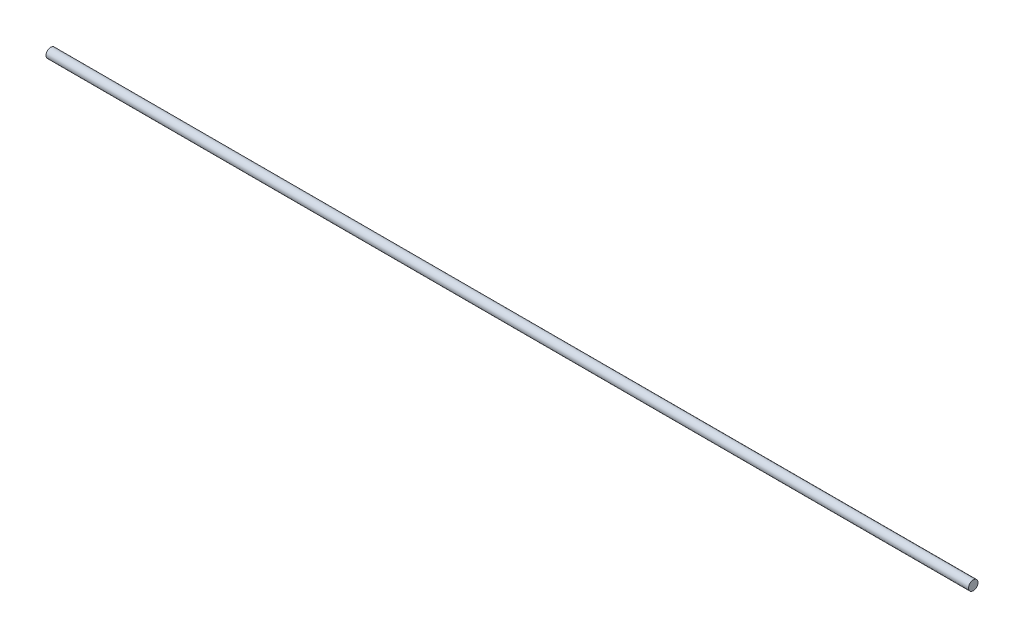
ISO-10303-21;
HEADER;
FILE_DESCRIPTION(('STEP AP214'),'2;1');
FILE_NAME('part.step','',(''),(''),'','','');
FILE_SCHEMA(('AUTOMOTIVE_DESIGN { 1 0 10303 214 1 1 1 1 }'));
ENDSEC;
DATA;
#1=APPLICATION_CONTEXT('core data for automotive mechanical design processes');
#2=APPLICATION_PROTOCOL_DEFINITION('international standard','automotive_design',2000,#1);
#3=PRODUCT_CONTEXT('',#1,'mechanical');
#4=PRODUCT('Part','Part','',(#3));
#5=PRODUCT_RELATED_PRODUCT_CATEGORY('part','',(#4));
#6=PRODUCT_DEFINITION_FORMATION('','',#4);
#7=PRODUCT_DEFINITION_CONTEXT('part definition',#1,'design');
#8=PRODUCT_DEFINITION('design','',#6,#7);
#9=PRODUCT_DEFINITION_SHAPE('','',#8);
#10=(LENGTH_UNIT() NAMED_UNIT(*) SI_UNIT(.MILLI.,.METRE.));
#11=(NAMED_UNIT(*) PLANE_ANGLE_UNIT() SI_UNIT($,.RADIAN.));
#12=(NAMED_UNIT(*) SI_UNIT($,.STERADIAN.) SOLID_ANGLE_UNIT());
#13=UNCERTAINTY_MEASURE_WITH_UNIT(LENGTH_MEASURE(1.E-05),#10,'distance_accuracy_value','');
#14=(GEOMETRIC_REPRESENTATION_CONTEXT(3) GLOBAL_UNCERTAINTY_ASSIGNED_CONTEXT((#13)) GLOBAL_UNIT_ASSIGNED_CONTEXT((#10,
#11,#12)) REPRESENTATION_CONTEXT('',''));
#15=CARTESIAN_POINT('',(0.,0.,0.));
#16=DIRECTION('',(0.,0.,1.));
#17=DIRECTION('',(1.,0.,0.));
#18=AXIS2_PLACEMENT_3D('',#15,#16,#17);
#19=CARTESIAN_POINT('',(618.33125,0.,0.));
#20=DIRECTION('',(-1.,0.,0.));
#21=DIRECTION('',(0.,0.,1.));
#22=AXIS2_PLACEMENT_3D('',#19,#20,#21);
#23=CYLINDRICAL_SURFACE('',#22,6.35);
#24=CARTESIAN_POINT('',(618.33125,0.,0.));
#25=DIRECTION('',(1.,0.,0.));
#26=DIRECTION('',(0.,0.,-1.));
#27=AXIS2_PLACEMENT_3D('',#24,#25,#26);
#28=CIRCLE('',#27,6.35);
#29=CARTESIAN_POINT('',(618.33125,0.,-6.35));
#30=VERTEX_POINT('',#29);
#31=EDGE_CURVE('E10',#30,#30,#28,.T.);
#32=ORIENTED_EDGE('',*,*,#31,.F.);
#33=EDGE_LOOP('',(#32));
#34=FACE_BOUND('',#33,.T.);
#35=CARTESIAN_POINT('',(-618.33125,0.,0.));
#36=DIRECTION('',(1.,0.,0.));
#37=DIRECTION('',(0.,0.,-1.));
#38=AXIS2_PLACEMENT_3D('',#35,#36,#37);
#39=CIRCLE('',#38,6.35);
#40=CARTESIAN_POINT('',(-618.33125,0.,-6.35));
#41=VERTEX_POINT('',#40);
#42=EDGE_CURVE('E34',#41,#41,#39,.T.);
#43=ORIENTED_EDGE('',*,*,#42,.T.);
#44=EDGE_LOOP('',(#43));
#45=FACE_BOUND('',#44,.T.);
#46=ADVANCED_FACE('F31',(#34,#45),#23,.T.);
#47=CARTESIAN_POINT('',(618.33125,0.,0.));
#48=DIRECTION('',(1.,0.,0.));
#49=DIRECTION('',(0.,0.,-1.));
#50=AXIS2_PLACEMENT_3D('',#47,#48,#49);
#51=PLANE('',#50);
#52=ORIENTED_EDGE('',*,*,#31,.T.);
#53=EDGE_LOOP('',(#52));
#54=FACE_BOUND('',#53,.T.);
#55=ADVANCED_FACE('F46',(#54),#51,.T.);
#56=CARTESIAN_POINT('',(-618.33125,0.,0.));
#57=DIRECTION('',(1.,0.,0.));
#58=DIRECTION('',(0.,0.,-1.));
#59=AXIS2_PLACEMENT_3D('',#56,#57,#58);
#60=PLANE('',#59);
#61=ORIENTED_EDGE('',*,*,#42,.F.);
#62=EDGE_LOOP('',(#61));
#63=FACE_BOUND('',#62,.T.);
#64=ADVANCED_FACE('F44',(#63),#60,.F.);
#65=CLOSED_SHELL('',(#46,#55,#64));
#66=MANIFOLD_SOLID_BREP('B2',#65);
#67=ADVANCED_BREP_SHAPE_REPRESENTATION('',(#18,#66),#14);
#68=SHAPE_DEFINITION_REPRESENTATION(#9,#67);
ENDSEC;
END-ISO-10303-21;
